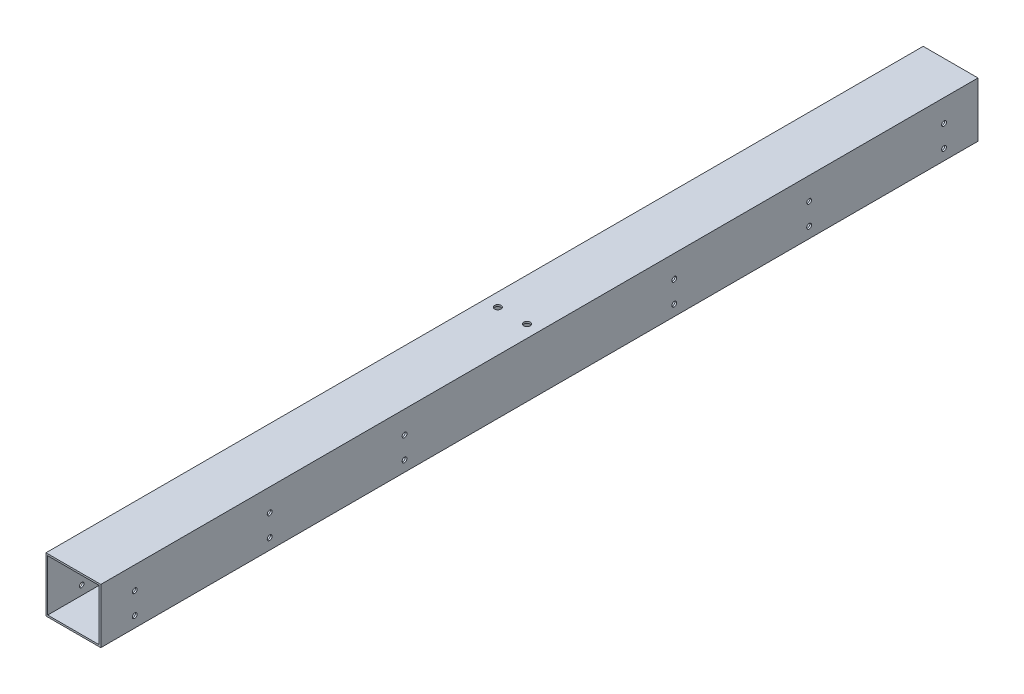
ISO-10303-21;
HEADER;
FILE_DESCRIPTION(('STEP AP214'),'2;1');
FILE_NAME('part.step','',(''),(''),'','','');
FILE_SCHEMA(('AUTOMOTIVE_DESIGN { 1 0 10303 214 1 1 1 1 }'));
ENDSEC;
DATA;
#1=APPLICATION_CONTEXT('core data for automotive mechanical design processes');
#2=APPLICATION_PROTOCOL_DEFINITION('international standard','automotive_design',2000,#1);
#3=PRODUCT_CONTEXT('',#1,'mechanical');
#4=PRODUCT('Part','Part','',(#3));
#5=PRODUCT_RELATED_PRODUCT_CATEGORY('part','',(#4));
#6=PRODUCT_DEFINITION_FORMATION('','',#4);
#7=PRODUCT_DEFINITION_CONTEXT('part definition',#1,'design');
#8=PRODUCT_DEFINITION('design','',#6,#7);
#9=PRODUCT_DEFINITION_SHAPE('','',#8);
#10=(LENGTH_UNIT() NAMED_UNIT(*) SI_UNIT(.MILLI.,.METRE.));
#11=(NAMED_UNIT(*) PLANE_ANGLE_UNIT() SI_UNIT($,.RADIAN.));
#12=(NAMED_UNIT(*) SI_UNIT($,.STERADIAN.) SOLID_ANGLE_UNIT());
#13=UNCERTAINTY_MEASURE_WITH_UNIT(LENGTH_MEASURE(1.E-05),#10,'distance_accuracy_value','');
#14=(GEOMETRIC_REPRESENTATION_CONTEXT(3) GLOBAL_UNCERTAINTY_ASSIGNED_CONTEXT((#13)) GLOBAL_UNIT_ASSIGNED_CONTEXT((#10,
#11,#12)) REPRESENTATION_CONTEXT('',''));
#15=CARTESIAN_POINT('',(0.,0.,0.));
#16=DIRECTION('',(0.,0.,1.));
#17=DIRECTION('',(1.,0.,0.));
#18=AXIS2_PLACEMENT_3D('',#15,#16,#17);
#19=CARTESIAN_POINT('',(-50.8,50.8,813.));
#20=DIRECTION('',(0.,-1.,0.));
#21=DIRECTION('',(0.,0.,-1.));
#22=AXIS2_PLACEMENT_3D('',#19,#20,#21);
#23=PLANE('',#22);
#24=DIRECTION('',(-1.,0.,0.));
#25=VECTOR('',#24,1.);
#26=CARTESIAN_POINT('',(-50.8,50.8,-813.));
#27=LINE('',#26,#25);
#28=CARTESIAN_POINT('',(50.8,50.8,-813.));
#29=VERTEX_POINT('',#28);
#30=CARTESIAN_POINT('',(-50.8,50.8,-813.));
#31=VERTEX_POINT('',#30);
#32=EDGE_CURVE('E204',#29,#31,#27,.T.);
#33=ORIENTED_EDGE('',*,*,#32,.T.);
#34=DIRECTION('',(0.,0.,-1.));
#35=VECTOR('',#34,1.);
#36=CARTESIAN_POINT('',(-50.8,50.8,813.));
#37=LINE('',#36,#35);
#38=CARTESIAN_POINT('',(-50.8,50.8,813.));
#39=VERTEX_POINT('',#38);
#40=EDGE_CURVE('E219',#39,#31,#37,.T.);
#41=ORIENTED_EDGE('',*,*,#40,.F.);
#42=DIRECTION('',(-1.,0.,0.));
#43=VECTOR('',#42,1.);
#44=CARTESIAN_POINT('',(-50.8,50.8,813.));
#45=LINE('',#44,#43);
#46=CARTESIAN_POINT('',(50.8,50.8,813.));
#47=VERTEX_POINT('',#46);
#48=EDGE_CURVE('E190',#47,#39,#45,.T.);
#49=ORIENTED_EDGE('',*,*,#48,.F.);
#50=DIRECTION('',(0.,0.,-1.));
#51=VECTOR('',#50,1.);
#52=CARTESIAN_POINT('',(50.8,50.8,813.));
#53=LINE('',#52,#51);
#54=EDGE_CURVE('E223',#47,#29,#53,.T.);
#55=ORIENTED_EDGE('',*,*,#54,.T.);
#56=EDGE_LOOP('',(#33,#41,#49,#55));
#57=FACE_BOUND('',#56,.T.);
#58=CARTESIAN_POINT('',(27.8,50.8,0.));
#59=DIRECTION('',(0.,1.,0.));
#60=DIRECTION('',(0.,0.,1.));
#61=AXIS2_PLACEMENT_3D('',#58,#59,#60);
#62=CIRCLE('',#61,6.);
#63=CARTESIAN_POINT('',(27.8,50.8,5.99999999999999));
#64=VERTEX_POINT('',#63);
#65=EDGE_CURVE('E529',#64,#64,#62,.T.);
#66=ORIENTED_EDGE('',*,*,#65,.F.);
#67=EDGE_LOOP('',(#66));
#68=FACE_BOUND('',#67,.T.);
#69=CARTESIAN_POINT('',(-26.2,50.8,0.));
#70=DIRECTION('',(0.,1.,0.));
#71=DIRECTION('',(0.,0.,1.));
#72=AXIS2_PLACEMENT_3D('',#69,#70,#71);
#73=CIRCLE('',#72,6.);
#74=CARTESIAN_POINT('',(-26.2,50.8,6.00000000000001));
#75=VERTEX_POINT('',#74);
#76=EDGE_CURVE('E524',#75,#75,#73,.T.);
#77=ORIENTED_EDGE('',*,*,#76,.F.);
#78=EDGE_LOOP('',(#77));
#79=FACE_BOUND('',#78,.T.);
#80=ADVANCED_FACE('F67',(#57,#68,#79),#23,.F.);
#81=CARTESIAN_POINT('',(-50.8,-30.8,-750.));
#82=DIRECTION('',(-1.,0.,0.));
#83=DIRECTION('',(0.,0.,1.));
#84=AXIS2_PLACEMENT_3D('',#81,#82,#83);
#85=CYLINDRICAL_SURFACE('',#84,4.2);
#86=CARTESIAN_POINT('',(-50.8,-30.8,-750.));
#87=DIRECTION('',(-1.,0.,0.));
#88=DIRECTION('',(0.,0.,1.));
#89=AXIS2_PLACEMENT_3D('',#86,#87,#88);
#90=CIRCLE('',#89,4.2);
#91=CARTESIAN_POINT('',(-50.8,-30.8,-745.8));
#92=VERTEX_POINT('',#91);
#93=EDGE_CURVE('E76',#92,#92,#90,.T.);
#94=ORIENTED_EDGE('',*,*,#93,.T.);
#95=EDGE_LOOP('',(#94));
#96=FACE_BOUND('',#95,.T.);
#97=CARTESIAN_POINT('',(-47.625,-30.8,-750.));
#98=DIRECTION('',(1.,0.,0.));
#99=DIRECTION('',(0.,1.,0.));
#100=AXIS2_PLACEMENT_3D('',#97,#98,#99);
#101=CIRCLE('',#100,4.2);
#102=CARTESIAN_POINT('',(-47.625,-26.6,-750.));
#103=VERTEX_POINT('',#102);
#104=EDGE_CURVE('E12',#103,#103,#101,.T.);
#105=ORIENTED_EDGE('',*,*,#104,.T.);
#106=EDGE_LOOP('',(#105));
#107=FACE_BOUND('',#106,.T.);
#108=ADVANCED_FACE('F69',(#96,#107),#85,.F.);
#109=CARTESIAN_POINT('',(-50.8,-30.8,-500.));
#110=DIRECTION('',(-1.,0.,0.));
#111=DIRECTION('',(0.,0.,1.));
#112=AXIS2_PLACEMENT_3D('',#109,#110,#111);
#113=CYLINDRICAL_SURFACE('',#112,4.2);
#114=CARTESIAN_POINT('',(-50.8,-30.8,-500.));
#115=DIRECTION('',(-1.,0.,0.));
#116=DIRECTION('',(0.,0.,1.));
#117=AXIS2_PLACEMENT_3D('',#114,#115,#116);
#118=CIRCLE('',#117,4.2);
#119=CARTESIAN_POINT('',(-50.8,-30.8,-495.8));
#120=VERTEX_POINT('',#119);
#121=EDGE_CURVE('E275',#120,#120,#118,.T.);
#122=ORIENTED_EDGE('',*,*,#121,.T.);
#123=EDGE_LOOP('',(#122));
#124=FACE_BOUND('',#123,.T.);
#125=CARTESIAN_POINT('',(-47.625,-30.8,-500.));
#126=DIRECTION('',(1.,0.,0.));
#127=DIRECTION('',(0.,1.,0.));
#128=AXIS2_PLACEMENT_3D('',#125,#126,#127);
#129=CIRCLE('',#128,4.2);
#130=CARTESIAN_POINT('',(-47.625,-26.6,-500.));
#131=VERTEX_POINT('',#130);
#132=EDGE_CURVE('E279',#131,#131,#129,.T.);
#133=ORIENTED_EDGE('',*,*,#132,.T.);
#134=EDGE_LOOP('',(#133));
#135=FACE_BOUND('',#134,.T.);
#136=ADVANCED_FACE('F312',(#124,#135),#113,.F.);
#137=CARTESIAN_POINT('',(-50.8,-30.8,-250.));
#138=DIRECTION('',(-1.,0.,0.));
#139=DIRECTION('',(0.,0.,1.));
#140=AXIS2_PLACEMENT_3D('',#137,#138,#139);
#141=CYLINDRICAL_SURFACE('',#140,4.2);
#142=CARTESIAN_POINT('',(-50.8,-30.8,-250.));
#143=DIRECTION('',(-1.,0.,0.));
#144=DIRECTION('',(0.,0.,1.));
#145=AXIS2_PLACEMENT_3D('',#142,#143,#144);
#146=CIRCLE('',#145,4.2);
#147=CARTESIAN_POINT('',(-50.8,-30.8,-245.8));
#148=VERTEX_POINT('',#147);
#149=EDGE_CURVE('E267',#148,#148,#146,.T.);
#150=ORIENTED_EDGE('',*,*,#149,.T.);
#151=EDGE_LOOP('',(#150));
#152=FACE_BOUND('',#151,.T.);
#153=CARTESIAN_POINT('',(-47.625,-30.8,-250.));
#154=DIRECTION('',(1.,0.,0.));
#155=DIRECTION('',(0.,1.,0.));
#156=AXIS2_PLACEMENT_3D('',#153,#154,#155);
#157=CIRCLE('',#156,4.2);
#158=CARTESIAN_POINT('',(-47.625,-26.6,-250.));
#159=VERTEX_POINT('',#158);
#160=EDGE_CURVE('E271',#159,#159,#157,.T.);
#161=ORIENTED_EDGE('',*,*,#160,.T.);
#162=EDGE_LOOP('',(#161));
#163=FACE_BOUND('',#162,.T.);
#164=ADVANCED_FACE('F334',(#152,#163),#141,.F.);
#165=CARTESIAN_POINT('',(-50.8,-30.8,250.));
#166=DIRECTION('',(-1.,0.,0.));
#167=DIRECTION('',(0.,0.,1.));
#168=AXIS2_PLACEMENT_3D('',#165,#166,#167);
#169=CYLINDRICAL_SURFACE('',#168,4.2);
#170=CARTESIAN_POINT('',(-50.8,-30.8,250.));
#171=DIRECTION('',(-1.,0.,0.));
#172=DIRECTION('',(0.,0.,1.));
#173=AXIS2_PLACEMENT_3D('',#170,#171,#172);
#174=CIRCLE('',#173,4.2);
#175=CARTESIAN_POINT('',(-50.8,-30.8,254.2));
#176=VERTEX_POINT('',#175);
#177=EDGE_CURVE('E259',#176,#176,#174,.T.);
#178=ORIENTED_EDGE('',*,*,#177,.T.);
#179=EDGE_LOOP('',(#178));
#180=FACE_BOUND('',#179,.T.);
#181=CARTESIAN_POINT('',(-47.625,-30.8,250.));
#182=DIRECTION('',(1.,0.,0.));
#183=DIRECTION('',(0.,1.,0.));
#184=AXIS2_PLACEMENT_3D('',#181,#182,#183);
#185=CIRCLE('',#184,4.2);
#186=CARTESIAN_POINT('',(-47.625,-26.6,250.));
#187=VERTEX_POINT('',#186);
#188=EDGE_CURVE('E263',#187,#187,#185,.T.);
#189=ORIENTED_EDGE('',*,*,#188,.T.);
#190=EDGE_LOOP('',(#189));
#191=FACE_BOUND('',#190,.T.);
#192=ADVANCED_FACE('F330',(#180,#191),#169,.F.);
#193=CARTESIAN_POINT('',(-50.8,9.2,-750.));
#194=DIRECTION('',(-1.,0.,0.));
#195=DIRECTION('',(0.,0.,1.));
#196=AXIS2_PLACEMENT_3D('',#193,#194,#195);
#197=CYLINDRICAL_SURFACE('',#196,4.2);
#198=CARTESIAN_POINT('',(-50.8,9.2,-750.));
#199=DIRECTION('',(-1.,0.,0.));
#200=DIRECTION('',(0.,0.,1.));
#201=AXIS2_PLACEMENT_3D('',#198,#199,#200);
#202=CIRCLE('',#201,4.2);
#203=CARTESIAN_POINT('',(-50.8,9.2,-745.8));
#204=VERTEX_POINT('',#203);
#205=EDGE_CURVE('E251',#204,#204,#202,.T.);
#206=ORIENTED_EDGE('',*,*,#205,.T.);
#207=EDGE_LOOP('',(#206));
#208=FACE_BOUND('',#207,.T.);
#209=CARTESIAN_POINT('',(-47.625,9.2,-750.));
#210=DIRECTION('',(1.,0.,0.));
#211=DIRECTION('',(0.,1.,0.));
#212=AXIS2_PLACEMENT_3D('',#209,#210,#211);
#213=CIRCLE('',#212,4.2);
#214=CARTESIAN_POINT('',(-47.625,13.4,-750.));
#215=VERTEX_POINT('',#214);
#216=EDGE_CURVE('E255',#215,#215,#213,.T.);
#217=ORIENTED_EDGE('',*,*,#216,.T.);
#218=EDGE_LOOP('',(#217));
#219=FACE_BOUND('',#218,.T.);
#220=ADVANCED_FACE('F326',(#208,#219),#197,.F.);
#221=CARTESIAN_POINT('',(-50.8,9.2,-500.));
#222=DIRECTION('',(-1.,0.,0.));
#223=DIRECTION('',(0.,0.,1.));
#224=AXIS2_PLACEMENT_3D('',#221,#222,#223);
#225=CYLINDRICAL_SURFACE('',#224,4.2);
#226=CARTESIAN_POINT('',(-50.8,9.2,-500.));
#227=DIRECTION('',(-1.,0.,0.));
#228=DIRECTION('',(0.,0.,1.));
#229=AXIS2_PLACEMENT_3D('',#226,#227,#228);
#230=CIRCLE('',#229,4.2);
#231=CARTESIAN_POINT('',(-50.8,9.2,-495.8));
#232=VERTEX_POINT('',#231);
#233=EDGE_CURVE('E243',#232,#232,#230,.T.);
#234=ORIENTED_EDGE('',*,*,#233,.T.);
#235=EDGE_LOOP('',(#234));
#236=FACE_BOUND('',#235,.T.);
#237=CARTESIAN_POINT('',(-47.625,9.2,-500.));
#238=DIRECTION('',(1.,0.,0.));
#239=DIRECTION('',(0.,1.,0.));
#240=AXIS2_PLACEMENT_3D('',#237,#238,#239);
#241=CIRCLE('',#240,4.2);
#242=CARTESIAN_POINT('',(-47.625,13.4,-500.));
#243=VERTEX_POINT('',#242);
#244=EDGE_CURVE('E247',#243,#243,#241,.T.);
#245=ORIENTED_EDGE('',*,*,#244,.T.);
#246=EDGE_LOOP('',(#245));
#247=FACE_BOUND('',#246,.T.);
#248=ADVANCED_FACE('F322',(#236,#247),#225,.F.);
#249=CARTESIAN_POINT('',(-50.8,9.2,-250.));
#250=DIRECTION('',(-1.,0.,0.));
#251=DIRECTION('',(0.,0.,1.));
#252=AXIS2_PLACEMENT_3D('',#249,#250,#251);
#253=CYLINDRICAL_SURFACE('',#252,4.2);
#254=CARTESIAN_POINT('',(-50.8,9.2,-250.));
#255=DIRECTION('',(-1.,0.,0.));
#256=DIRECTION('',(0.,0.,1.));
#257=AXIS2_PLACEMENT_3D('',#254,#255,#256);
#258=CIRCLE('',#257,4.2);
#259=CARTESIAN_POINT('',(-50.8,9.2,-245.8));
#260=VERTEX_POINT('',#259);
#261=EDGE_CURVE('E235',#260,#260,#258,.T.);
#262=ORIENTED_EDGE('',*,*,#261,.T.);
#263=EDGE_LOOP('',(#262));
#264=FACE_BOUND('',#263,.T.);
#265=CARTESIAN_POINT('',(-47.625,9.2,-250.));
#266=DIRECTION('',(1.,0.,0.));
#267=DIRECTION('',(0.,1.,0.));
#268=AXIS2_PLACEMENT_3D('',#265,#266,#267);
#269=CIRCLE('',#268,4.2);
#270=CARTESIAN_POINT('',(-47.625,13.4,-250.));
#271=VERTEX_POINT('',#270);
#272=EDGE_CURVE('E239',#271,#271,#269,.T.);
#273=ORIENTED_EDGE('',*,*,#272,.T.);
#274=EDGE_LOOP('',(#273));
#275=FACE_BOUND('',#274,.T.);
#276=ADVANCED_FACE('F300',(#264,#275),#253,.F.);
#277=CARTESIAN_POINT('',(-50.8,9.2,250.));
#278=DIRECTION('',(-1.,0.,0.));
#279=DIRECTION('',(0.,0.,1.));
#280=AXIS2_PLACEMENT_3D('',#277,#278,#279);
#281=CYLINDRICAL_SURFACE('',#280,4.2);
#282=CARTESIAN_POINT('',(-50.8,9.2,250.));
#283=DIRECTION('',(-1.,0.,0.));
#284=DIRECTION('',(0.,0.,1.));
#285=AXIS2_PLACEMENT_3D('',#282,#283,#284);
#286=CIRCLE('',#285,4.2);
#287=CARTESIAN_POINT('',(-50.8,9.2,254.2));
#288=VERTEX_POINT('',#287);
#289=EDGE_CURVE('E227',#288,#288,#286,.T.);
#290=ORIENTED_EDGE('',*,*,#289,.T.);
#291=EDGE_LOOP('',(#290));
#292=FACE_BOUND('',#291,.T.);
#293=CARTESIAN_POINT('',(-47.625,9.2,250.));
#294=DIRECTION('',(1.,0.,0.));
#295=DIRECTION('',(0.,1.,0.));
#296=AXIS2_PLACEMENT_3D('',#293,#294,#295);
#297=CIRCLE('',#296,4.2);
#298=CARTESIAN_POINT('',(-47.625,13.4,250.));
#299=VERTEX_POINT('',#298);
#300=EDGE_CURVE('E231',#299,#299,#297,.T.);
#301=ORIENTED_EDGE('',*,*,#300,.T.);
#302=EDGE_LOOP('',(#301));
#303=FACE_BOUND('',#302,.T.);
#304=ADVANCED_FACE('F290',(#292,#303),#281,.F.);
#305=CARTESIAN_POINT('',(-50.8,50.8,813.));
#306=DIRECTION('',(1.,0.,0.));
#307=DIRECTION('',(0.,1.,0.));
#308=AXIS2_PLACEMENT_3D('',#305,#306,#307);
#309=PLANE('',#308);
#310=CARTESIAN_POINT('',(-50.8,-30.8,500.));
#311=DIRECTION('',(-1.,0.,0.));
#312=DIRECTION('',(0.,0.,1.));
#313=AXIS2_PLACEMENT_3D('',#310,#311,#312);
#314=CIRCLE('',#313,4.2);
#315=CARTESIAN_POINT('',(-50.8,-30.8,504.2));
#316=VERTEX_POINT('',#315);
#317=EDGE_CURVE('E621',#316,#316,#314,.T.);
#318=ORIENTED_EDGE('',*,*,#317,.F.);
#319=EDGE_LOOP('',(#318));
#320=FACE_BOUND('',#319,.T.);
#321=CARTESIAN_POINT('',(-50.8,9.2,500.));
#322=DIRECTION('',(-1.,0.,0.));
#323=DIRECTION('',(0.,0.,1.));
#324=AXIS2_PLACEMENT_3D('',#321,#322,#323);
#325=CIRCLE('',#324,4.2);
#326=CARTESIAN_POINT('',(-50.8,9.2,504.2));
#327=VERTEX_POINT('',#326);
#328=EDGE_CURVE('E629',#327,#327,#325,.T.);
#329=ORIENTED_EDGE('',*,*,#328,.F.);
#330=EDGE_LOOP('',(#329));
#331=FACE_BOUND('',#330,.T.);
#332=DIRECTION('',(0.,-1.,0.));
#333=VECTOR('',#332,1.);
#334=CARTESIAN_POINT('',(-50.8,50.8,-813.));
#335=LINE('',#334,#333);
#336=CARTESIAN_POINT('',(-50.8,-50.8,-813.));
#337=VERTEX_POINT('',#336);
#338=EDGE_CURVE('E207',#31,#337,#335,.T.);
#339=ORIENTED_EDGE('',*,*,#338,.T.);
#340=DIRECTION('',(0.,0.,-1.));
#341=VECTOR('',#340,1.);
#342=CARTESIAN_POINT('',(-50.8,-50.8,813.));
#343=LINE('',#342,#341);
#344=CARTESIAN_POINT('',(-50.8,-50.8,813.));
#345=VERTEX_POINT('',#344);
#346=EDGE_CURVE('E215',#345,#337,#343,.T.);
#347=ORIENTED_EDGE('',*,*,#346,.F.);
#348=DIRECTION('',(0.,-1.,0.));
#349=VECTOR('',#348,1.);
#350=CARTESIAN_POINT('',(-50.8,50.8,813.));
#351=LINE('',#350,#349);
#352=EDGE_CURVE('E194',#39,#345,#351,.T.);
#353=ORIENTED_EDGE('',*,*,#352,.F.);
#354=ORIENTED_EDGE('',*,*,#40,.T.);
#355=EDGE_LOOP('',(#339,#347,#353,#354));
#356=FACE_BOUND('',#355,.T.);
#357=CARTESIAN_POINT('',(-50.8,-30.8,750.));
#358=DIRECTION('',(-1.,0.,0.));
#359=DIRECTION('',(0.,0.,1.));
#360=AXIS2_PLACEMENT_3D('',#357,#358,#359);
#361=CIRCLE('',#360,4.2);
#362=CARTESIAN_POINT('',(-50.8,-30.8,754.2));
#363=VERTEX_POINT('',#362);
#364=EDGE_CURVE('E391',#363,#363,#361,.T.);
#365=ORIENTED_EDGE('',*,*,#364,.F.);
#366=EDGE_LOOP('',(#365));
#367=FACE_BOUND('',#366,.T.);
#368=CARTESIAN_POINT('',(-50.8,9.2,750.));
#369=DIRECTION('',(-1.,0.,0.));
#370=DIRECTION('',(0.,0.,1.));
#371=AXIS2_PLACEMENT_3D('',#368,#369,#370);
#372=CIRCLE('',#371,4.2);
#373=CARTESIAN_POINT('',(-50.8,9.2,754.2));
#374=VERTEX_POINT('',#373);
#375=EDGE_CURVE('E395',#374,#374,#372,.T.);
#376=ORIENTED_EDGE('',*,*,#375,.F.);
#377=EDGE_LOOP('',(#376));
#378=FACE_BOUND('',#377,.T.);
#379=ORIENTED_EDGE('',*,*,#289,.F.);
#380=EDGE_LOOP('',(#379));
#381=FACE_BOUND('',#380,.T.);
#382=ORIENTED_EDGE('',*,*,#261,.F.);
#383=EDGE_LOOP('',(#382));
#384=FACE_BOUND('',#383,.T.);
#385=ORIENTED_EDGE('',*,*,#233,.F.);
#386=EDGE_LOOP('',(#385));
#387=FACE_BOUND('',#386,.T.);
#388=ORIENTED_EDGE('',*,*,#205,.F.);
#389=EDGE_LOOP('',(#388));
#390=FACE_BOUND('',#389,.T.);
#391=ORIENTED_EDGE('',*,*,#177,.F.);
#392=EDGE_LOOP('',(#391));
#393=FACE_BOUND('',#392,.T.);
#394=ORIENTED_EDGE('',*,*,#149,.F.);
#395=EDGE_LOOP('',(#394));
#396=FACE_BOUND('',#395,.T.);
#397=ORIENTED_EDGE('',*,*,#121,.F.);
#398=EDGE_LOOP('',(#397));
#399=FACE_BOUND('',#398,.T.);
#400=ORIENTED_EDGE('',*,*,#93,.F.);
#401=EDGE_LOOP('',(#400));
#402=FACE_BOUND('',#401,.T.);
#403=ADVANCED_FACE('F288',(#320,#331,#356,#367,#378,#381,#384,#387,#390,#393,#396,#399,#402),
#309,.F.);
#404=CARTESIAN_POINT('',(0.,0.,813.));
#405=DIRECTION('',(0.,0.,1.));
#406=DIRECTION('',(1.,0.,0.));
#407=AXIS2_PLACEMENT_3D('',#404,#405,#406);
#408=PLANE('',#407);
#409=DIRECTION('',(0.,1.,0.));
#410=VECTOR('',#409,1.);
#411=CARTESIAN_POINT('',(50.8,50.8,813.));
#412=LINE('',#411,#410);
#413=CARTESIAN_POINT('',(50.8,-50.8,813.));
#414=VERTEX_POINT('',#413);
#415=EDGE_CURVE('E186',#414,#47,#412,.T.);
#416=ORIENTED_EDGE('',*,*,#415,.T.);
#417=ORIENTED_EDGE('',*,*,#48,.T.);
#418=ORIENTED_EDGE('',*,*,#352,.T.);
#419=DIRECTION('',(1.,0.,0.));
#420=VECTOR('',#419,1.);
#421=CARTESIAN_POINT('',(-50.8,-50.8,813.));
#422=LINE('',#421,#420);
#423=EDGE_CURVE('E197',#345,#414,#422,.T.);
#424=ORIENTED_EDGE('',*,*,#423,.T.);
#425=EDGE_LOOP('',(#416,#417,#418,#424));
#426=FACE_BOUND('',#425,.T.);
#427=DIRECTION('',(-1.,0.,0.));
#428=VECTOR('',#427,1.);
#429=CARTESIAN_POINT('',(-50.8,47.625,813.));
#430=LINE('',#429,#428);
#431=CARTESIAN_POINT('',(47.625,47.625,813.));
#432=VERTEX_POINT('',#431);
#433=CARTESIAN_POINT('',(-47.625,47.625,813.));
#434=VERTEX_POINT('',#433);
#435=EDGE_CURVE('E144',#432,#434,#430,.T.);
#436=ORIENTED_EDGE('',*,*,#435,.F.);
#437=DIRECTION('',(0.,1.,0.));
#438=VECTOR('',#437,1.);
#439=CARTESIAN_POINT('',(47.625,50.8,813.));
#440=LINE('',#439,#438);
#441=CARTESIAN_POINT('',(47.625,-47.625,813.));
#442=VERTEX_POINT('',#441);
#443=EDGE_CURVE('E135',#442,#432,#440,.T.);
#444=ORIENTED_EDGE('',*,*,#443,.F.);
#445=DIRECTION('',(1.,0.,0.));
#446=VECTOR('',#445,1.);
#447=CARTESIAN_POINT('',(-50.8,-47.625,813.));
#448=LINE('',#447,#446);
#449=CARTESIAN_POINT('',(-47.625,-47.625,813.));
#450=VERTEX_POINT('',#449);
#451=EDGE_CURVE('E162',#450,#442,#448,.T.);
#452=ORIENTED_EDGE('',*,*,#451,.F.);
#453=DIRECTION('',(0.,-1.,0.));
#454=VECTOR('',#453,1.);
#455=CARTESIAN_POINT('',(-47.625,50.8,813.));
#456=LINE('',#455,#454);
#457=EDGE_CURVE('E158',#434,#450,#456,.T.);
#458=ORIENTED_EDGE('',*,*,#457,.F.);
#459=EDGE_LOOP('',(#436,#444,#452,#458));
#460=FACE_BOUND('',#459,.T.);
#461=ADVANCED_FACE('F157',(#426,#460),#408,.T.);
#462=CARTESIAN_POINT('',(0.,0.,-813.));
#463=DIRECTION('',(0.,0.,1.));
#464=DIRECTION('',(1.,0.,0.));
#465=AXIS2_PLACEMENT_3D('',#462,#463,#464);
#466=PLANE('',#465);
#467=DIRECTION('',(0.,1.,0.));
#468=VECTOR('',#467,1.);
#469=CARTESIAN_POINT('',(50.8,50.8,-813.));
#470=LINE('',#469,#468);
#471=CARTESIAN_POINT('',(50.8,-50.8,-813.));
#472=VERTEX_POINT('',#471);
#473=EDGE_CURVE('E153',#472,#29,#470,.T.);
#474=ORIENTED_EDGE('',*,*,#473,.F.);
#475=DIRECTION('',(1.,0.,0.));
#476=VECTOR('',#475,1.);
#477=CARTESIAN_POINT('',(-50.8,-50.8,-813.));
#478=LINE('',#477,#476);
#479=EDGE_CURVE('E191',#337,#472,#478,.T.);
#480=ORIENTED_EDGE('',*,*,#479,.F.);
#481=ORIENTED_EDGE('',*,*,#338,.F.);
#482=ORIENTED_EDGE('',*,*,#32,.F.);
#483=EDGE_LOOP('',(#474,#480,#481,#482));
#484=FACE_BOUND('',#483,.T.);
#485=DIRECTION('',(0.,1.,0.));
#486=VECTOR('',#485,1.);
#487=CARTESIAN_POINT('',(47.625,50.8,-813.));
#488=LINE('',#487,#486);
#489=CARTESIAN_POINT('',(47.625,-47.625,-813.));
#490=VERTEX_POINT('',#489);
#491=CARTESIAN_POINT('',(47.625,47.625,-813.));
#492=VERTEX_POINT('',#491);
#493=EDGE_CURVE('E91',#490,#492,#488,.T.);
#494=ORIENTED_EDGE('',*,*,#493,.T.);
#495=DIRECTION('',(-1.,0.,0.));
#496=VECTOR('',#495,1.);
#497=CARTESIAN_POINT('',(-50.8,47.625,-813.));
#498=LINE('',#497,#496);
#499=CARTESIAN_POINT('',(-47.625,47.625,-813.));
#500=VERTEX_POINT('',#499);
#501=EDGE_CURVE('E151',#492,#500,#498,.T.);
#502=ORIENTED_EDGE('',*,*,#501,.T.);
#503=DIRECTION('',(0.,-1.,0.));
#504=VECTOR('',#503,1.);
#505=CARTESIAN_POINT('',(-47.625,50.8,-813.));
#506=LINE('',#505,#504);
#507=CARTESIAN_POINT('',(-47.625,-47.625,-813.));
#508=VERTEX_POINT('',#507);
#509=EDGE_CURVE('E173',#500,#508,#506,.T.);
#510=ORIENTED_EDGE('',*,*,#509,.T.);
#511=DIRECTION('',(1.,0.,0.));
#512=VECTOR('',#511,1.);
#513=CARTESIAN_POINT('',(-50.8,-47.625,-813.));
#514=LINE('',#513,#512);
#515=EDGE_CURVE('E145',#508,#490,#514,.T.);
#516=ORIENTED_EDGE('',*,*,#515,.T.);
#517=EDGE_LOOP('',(#494,#502,#510,#516));
#518=FACE_BOUND('',#517,.T.);
#519=ADVANCED_FACE('F297',(#484,#518),#466,.F.);
#520=CARTESIAN_POINT('',(50.8,50.8,813.));
#521=DIRECTION('',(-1.,0.,0.));
#522=DIRECTION('',(0.,-1.,0.));
#523=AXIS2_PLACEMENT_3D('',#520,#521,#522);
#524=PLANE('',#523);
#525=CARTESIAN_POINT('',(50.8,9.20000000000002,-750.));
#526=DIRECTION('',(-1.,0.,0.));
#527=DIRECTION('',(0.,-1.,0.));
#528=AXIS2_PLACEMENT_3D('',#525,#526,#527);
#529=CIRCLE('',#528,4.49999999999999);
#530=CARTESIAN_POINT('',(50.8,4.70000000000002,-750.));
#531=VERTEX_POINT('',#530);
#532=EDGE_CURVE('E545',#531,#531,#529,.T.);
#533=ORIENTED_EDGE('',*,*,#532,.T.);
#534=EDGE_LOOP('',(#533));
#535=FACE_BOUND('',#534,.T.);
#536=CARTESIAN_POINT('',(50.8,-30.8,-750.));
#537=DIRECTION('',(-1.,0.,0.));
#538=DIRECTION('',(0.,-1.,0.));
#539=AXIS2_PLACEMENT_3D('',#536,#537,#538);
#540=CIRCLE('',#539,4.49999999999999);
#541=CARTESIAN_POINT('',(50.8,-35.3,-750.));
#542=VERTEX_POINT('',#541);
#543=EDGE_CURVE('E553',#542,#542,#540,.T.);
#544=ORIENTED_EDGE('',*,*,#543,.T.);
#545=EDGE_LOOP('',(#544));
#546=FACE_BOUND('',#545,.T.);
#547=CARTESIAN_POINT('',(50.8,9.20000000000002,-500.));
#548=DIRECTION('',(-1.,0.,0.));
#549=DIRECTION('',(0.,-1.,0.));
#550=AXIS2_PLACEMENT_3D('',#547,#548,#549);
#551=CIRCLE('',#550,4.49999999999999);
#552=CARTESIAN_POINT('',(50.8,4.70000000000002,-500.));
#553=VERTEX_POINT('',#552);
#554=EDGE_CURVE('E561',#553,#553,#551,.T.);
#555=ORIENTED_EDGE('',*,*,#554,.T.);
#556=EDGE_LOOP('',(#555));
#557=FACE_BOUND('',#556,.T.);
#558=CARTESIAN_POINT('',(50.8,-30.8,-500.));
#559=DIRECTION('',(-1.,0.,0.));
#560=DIRECTION('',(0.,-1.,0.));
#561=AXIS2_PLACEMENT_3D('',#558,#559,#560);
#562=CIRCLE('',#561,4.49999999999999);
#563=CARTESIAN_POINT('',(50.8,-35.3,-500.));
#564=VERTEX_POINT('',#563);
#565=EDGE_CURVE('E569',#564,#564,#562,.T.);
#566=ORIENTED_EDGE('',*,*,#565,.T.);
#567=EDGE_LOOP('',(#566));
#568=FACE_BOUND('',#567,.T.);
#569=CARTESIAN_POINT('',(50.8,9.20000000000002,-250.));
#570=DIRECTION('',(-1.,0.,0.));
#571=DIRECTION('',(0.,-1.,0.));
#572=AXIS2_PLACEMENT_3D('',#569,#570,#571);
#573=CIRCLE('',#572,4.49999999999999);
#574=CARTESIAN_POINT('',(50.8,4.70000000000002,-250.));
#575=VERTEX_POINT('',#574);
#576=EDGE_CURVE('E577',#575,#575,#573,.T.);
#577=ORIENTED_EDGE('',*,*,#576,.T.);
#578=EDGE_LOOP('',(#577));
#579=FACE_BOUND('',#578,.T.);
#580=CARTESIAN_POINT('',(50.8,-30.8,-250.));
#581=DIRECTION('',(-1.,0.,0.));
#582=DIRECTION('',(0.,-1.,0.));
#583=AXIS2_PLACEMENT_3D('',#580,#581,#582);
#584=CIRCLE('',#583,4.49999999999999);
#585=CARTESIAN_POINT('',(50.8,-35.3,-250.));
#586=VERTEX_POINT('',#585);
#587=EDGE_CURVE('E585',#586,#586,#584,.T.);
#588=ORIENTED_EDGE('',*,*,#587,.T.);
#589=EDGE_LOOP('',(#588));
#590=FACE_BOUND('',#589,.T.);
#591=CARTESIAN_POINT('',(50.8,9.20000000000002,250.));
#592=DIRECTION('',(-1.,0.,0.));
#593=DIRECTION('',(0.,-1.,0.));
#594=AXIS2_PLACEMENT_3D('',#591,#592,#593);
#595=CIRCLE('',#594,4.49999999999999);
#596=CARTESIAN_POINT('',(50.8,4.70000000000002,250.));
#597=VERTEX_POINT('',#596);
#598=EDGE_CURVE('E593',#597,#597,#595,.T.);
#599=ORIENTED_EDGE('',*,*,#598,.T.);
#600=EDGE_LOOP('',(#599));
#601=FACE_BOUND('',#600,.T.);
#602=CARTESIAN_POINT('',(50.8,-30.8,250.));
#603=DIRECTION('',(-1.,0.,0.));
#604=DIRECTION('',(0.,-1.,0.));
#605=AXIS2_PLACEMENT_3D('',#602,#603,#604);
#606=CIRCLE('',#605,4.49999999999999);
#607=CARTESIAN_POINT('',(50.8,-35.3,250.));
#608=VERTEX_POINT('',#607);
#609=EDGE_CURVE('E601',#608,#608,#606,.T.);
#610=ORIENTED_EDGE('',*,*,#609,.T.);
#611=EDGE_LOOP('',(#610));
#612=FACE_BOUND('',#611,.T.);
#613=CARTESIAN_POINT('',(50.8,9.20000000000002,500.));
#614=DIRECTION('',(-1.,0.,0.));
#615=DIRECTION('',(0.,-1.,0.));
#616=AXIS2_PLACEMENT_3D('',#613,#614,#615);
#617=CIRCLE('',#616,4.49999999999999);
#618=CARTESIAN_POINT('',(50.8,4.70000000000002,500.));
#619=VERTEX_POINT('',#618);
#620=EDGE_CURVE('E609',#619,#619,#617,.T.);
#621=ORIENTED_EDGE('',*,*,#620,.T.);
#622=EDGE_LOOP('',(#621));
#623=FACE_BOUND('',#622,.T.);
#624=CARTESIAN_POINT('',(50.8,-30.8,500.));
#625=DIRECTION('',(-1.,0.,0.));
#626=DIRECTION('',(0.,-1.,0.));
#627=AXIS2_PLACEMENT_3D('',#624,#625,#626);
#628=CIRCLE('',#627,4.49999999999999);
#629=CARTESIAN_POINT('',(50.8,-35.3,500.));
#630=VERTEX_POINT('',#629);
#631=EDGE_CURVE('E617',#630,#630,#628,.T.);
#632=ORIENTED_EDGE('',*,*,#631,.T.);
#633=EDGE_LOOP('',(#632));
#634=FACE_BOUND('',#633,.T.);
#635=CARTESIAN_POINT('',(50.8,9.20000000000002,750.));
#636=DIRECTION('',(-1.,0.,0.));
#637=DIRECTION('',(0.,-1.,0.));
#638=AXIS2_PLACEMENT_3D('',#635,#636,#637);
#639=CIRCLE('',#638,4.49999999999999);
#640=CARTESIAN_POINT('',(50.8,4.70000000000002,750.));
#641=VERTEX_POINT('',#640);
#642=EDGE_CURVE('E641',#641,#641,#639,.T.);
#643=ORIENTED_EDGE('',*,*,#642,.T.);
#644=EDGE_LOOP('',(#643));
#645=FACE_BOUND('',#644,.T.);
#646=CARTESIAN_POINT('',(50.8,-30.8,750.));
#647=DIRECTION('',(-1.,0.,0.));
#648=DIRECTION('',(0.,-1.,0.));
#649=AXIS2_PLACEMENT_3D('',#646,#647,#648);
#650=CIRCLE('',#649,4.49999999999999);
#651=CARTESIAN_POINT('',(50.8,-35.3,750.));
#652=VERTEX_POINT('',#651);
#653=EDGE_CURVE('E429',#652,#652,#650,.T.);
#654=ORIENTED_EDGE('',*,*,#653,.T.);
#655=EDGE_LOOP('',(#654));
#656=FACE_BOUND('',#655,.T.);
#657=ORIENTED_EDGE('',*,*,#473,.T.);
#658=ORIENTED_EDGE('',*,*,#54,.F.);
#659=ORIENTED_EDGE('',*,*,#415,.F.);
#660=DIRECTION('',(0.,0.,-1.));
#661=VECTOR('',#660,1.);
#662=CARTESIAN_POINT('',(50.8,-50.8,813.));
#663=LINE('',#662,#661);
#664=EDGE_CURVE('E200',#414,#472,#663,.T.);
#665=ORIENTED_EDGE('',*,*,#664,.T.);
#666=EDGE_LOOP('',(#657,#658,#659,#665));
#667=FACE_BOUND('',#666,.T.);
#668=ADVANCED_FACE('F315',(#535,#546,#557,#568,#579,#590,#601,#612,#623,#634,#645,#656,#667),
#524,.F.);
#669=CARTESIAN_POINT('',(-50.8,-50.8,813.));
#670=DIRECTION('',(0.,1.,0.));
#671=DIRECTION('',(0.,0.,1.));
#672=AXIS2_PLACEMENT_3D('',#669,#670,#671);
#673=PLANE('',#672);
#674=ORIENTED_EDGE('',*,*,#479,.T.);
#675=ORIENTED_EDGE('',*,*,#664,.F.);
#676=ORIENTED_EDGE('',*,*,#423,.F.);
#677=ORIENTED_EDGE('',*,*,#346,.T.);
#678=EDGE_LOOP('',(#674,#675,#676,#677));
#679=FACE_BOUND('',#678,.T.);
#680=ADVANCED_FACE('F317',(#679),#673,.F.);
#681=CARTESIAN_POINT('',(47.625,50.8,813.));
#682=DIRECTION('',(-1.,0.,0.));
#683=DIRECTION('',(0.,-1.,0.));
#684=AXIS2_PLACEMENT_3D('',#681,#682,#683);
#685=PLANE('',#684);
#686=CARTESIAN_POINT('',(47.625,9.20000000000002,-750.));
#687=DIRECTION('',(-1.,0.,0.));
#688=DIRECTION('',(0.,0.,1.));
#689=AXIS2_PLACEMENT_3D('',#686,#687,#688);
#690=CIRCLE('',#689,4.49999999999999);
#691=CARTESIAN_POINT('',(47.625,9.20000000000002,-745.5));
#692=VERTEX_POINT('',#691);
#693=EDGE_CURVE('E541',#692,#692,#690,.T.);
#694=ORIENTED_EDGE('',*,*,#693,.F.);
#695=EDGE_LOOP('',(#694));
#696=FACE_BOUND('',#695,.T.);
#697=CARTESIAN_POINT('',(47.625,-30.8,-750.));
#698=DIRECTION('',(-1.,0.,0.));
#699=DIRECTION('',(0.,0.,1.));
#700=AXIS2_PLACEMENT_3D('',#697,#698,#699);
#701=CIRCLE('',#700,4.49999999999999);
#702=CARTESIAN_POINT('',(47.625,-30.8,-745.5));
#703=VERTEX_POINT('',#702);
#704=EDGE_CURVE('E549',#703,#703,#701,.T.);
#705=ORIENTED_EDGE('',*,*,#704,.F.);
#706=EDGE_LOOP('',(#705));
#707=FACE_BOUND('',#706,.T.);
#708=CARTESIAN_POINT('',(47.625,9.20000000000002,-500.));
#709=DIRECTION('',(-1.,0.,0.));
#710=DIRECTION('',(0.,0.,1.));
#711=AXIS2_PLACEMENT_3D('',#708,#709,#710);
#712=CIRCLE('',#711,4.49999999999999);
#713=CARTESIAN_POINT('',(47.625,9.20000000000002,-495.5));
#714=VERTEX_POINT('',#713);
#715=EDGE_CURVE('E557',#714,#714,#712,.T.);
#716=ORIENTED_EDGE('',*,*,#715,.F.);
#717=EDGE_LOOP('',(#716));
#718=FACE_BOUND('',#717,.T.);
#719=CARTESIAN_POINT('',(47.625,-30.8,-500.));
#720=DIRECTION('',(-1.,0.,0.));
#721=DIRECTION('',(0.,0.,1.));
#722=AXIS2_PLACEMENT_3D('',#719,#720,#721);
#723=CIRCLE('',#722,4.49999999999999);
#724=CARTESIAN_POINT('',(47.625,-30.8,-495.5));
#725=VERTEX_POINT('',#724);
#726=EDGE_CURVE('E565',#725,#725,#723,.T.);
#727=ORIENTED_EDGE('',*,*,#726,.F.);
#728=EDGE_LOOP('',(#727));
#729=FACE_BOUND('',#728,.T.);
#730=CARTESIAN_POINT('',(47.625,9.20000000000002,-250.));
#731=DIRECTION('',(-1.,0.,0.));
#732=DIRECTION('',(0.,0.,1.));
#733=AXIS2_PLACEMENT_3D('',#730,#731,#732);
#734=CIRCLE('',#733,4.49999999999999);
#735=CARTESIAN_POINT('',(47.625,9.20000000000002,-245.5));
#736=VERTEX_POINT('',#735);
#737=EDGE_CURVE('E573',#736,#736,#734,.T.);
#738=ORIENTED_EDGE('',*,*,#737,.F.);
#739=EDGE_LOOP('',(#738));
#740=FACE_BOUND('',#739,.T.);
#741=CARTESIAN_POINT('',(47.625,-30.8,-250.));
#742=DIRECTION('',(-1.,0.,0.));
#743=DIRECTION('',(0.,0.,1.));
#744=AXIS2_PLACEMENT_3D('',#741,#742,#743);
#745=CIRCLE('',#744,4.49999999999999);
#746=CARTESIAN_POINT('',(47.625,-30.8,-245.5));
#747=VERTEX_POINT('',#746);
#748=EDGE_CURVE('E581',#747,#747,#745,.T.);
#749=ORIENTED_EDGE('',*,*,#748,.F.);
#750=EDGE_LOOP('',(#749));
#751=FACE_BOUND('',#750,.T.);
#752=CARTESIAN_POINT('',(47.625,9.20000000000002,250.));
#753=DIRECTION('',(-1.,0.,0.));
#754=DIRECTION('',(0.,0.,1.));
#755=AXIS2_PLACEMENT_3D('',#752,#753,#754);
#756=CIRCLE('',#755,4.49999999999999);
#757=CARTESIAN_POINT('',(47.625,9.20000000000002,254.5));
#758=VERTEX_POINT('',#757);
#759=EDGE_CURVE('E589',#758,#758,#756,.T.);
#760=ORIENTED_EDGE('',*,*,#759,.F.);
#761=EDGE_LOOP('',(#760));
#762=FACE_BOUND('',#761,.T.);
#763=CARTESIAN_POINT('',(47.625,-30.8,250.));
#764=DIRECTION('',(-1.,0.,0.));
#765=DIRECTION('',(0.,0.,1.));
#766=AXIS2_PLACEMENT_3D('',#763,#764,#765);
#767=CIRCLE('',#766,4.49999999999999);
#768=CARTESIAN_POINT('',(47.625,-30.8,254.5));
#769=VERTEX_POINT('',#768);
#770=EDGE_CURVE('E597',#769,#769,#767,.T.);
#771=ORIENTED_EDGE('',*,*,#770,.F.);
#772=EDGE_LOOP('',(#771));
#773=FACE_BOUND('',#772,.T.);
#774=CARTESIAN_POINT('',(47.625,9.20000000000002,500.));
#775=DIRECTION('',(-1.,0.,0.));
#776=DIRECTION('',(0.,0.,1.));
#777=AXIS2_PLACEMENT_3D('',#774,#775,#776);
#778=CIRCLE('',#777,4.49999999999999);
#779=CARTESIAN_POINT('',(47.625,9.20000000000002,504.5));
#780=VERTEX_POINT('',#779);
#781=EDGE_CURVE('E605',#780,#780,#778,.T.);
#782=ORIENTED_EDGE('',*,*,#781,.F.);
#783=EDGE_LOOP('',(#782));
#784=FACE_BOUND('',#783,.T.);
#785=CARTESIAN_POINT('',(47.625,-30.8,500.));
#786=DIRECTION('',(-1.,0.,0.));
#787=DIRECTION('',(0.,0.,1.));
#788=AXIS2_PLACEMENT_3D('',#785,#786,#787);
#789=CIRCLE('',#788,4.49999999999999);
#790=CARTESIAN_POINT('',(47.625,-30.8,504.5));
#791=VERTEX_POINT('',#790);
#792=EDGE_CURVE('E613',#791,#791,#789,.T.);
#793=ORIENTED_EDGE('',*,*,#792,.F.);
#794=EDGE_LOOP('',(#793));
#795=FACE_BOUND('',#794,.T.);
#796=CARTESIAN_POINT('',(47.625,9.20000000000002,750.));
#797=DIRECTION('',(-1.,0.,0.));
#798=DIRECTION('',(0.,0.,1.));
#799=AXIS2_PLACEMENT_3D('',#796,#797,#798);
#800=CIRCLE('',#799,4.49999999999999);
#801=CARTESIAN_POINT('',(47.625,9.20000000000002,754.5));
#802=VERTEX_POINT('',#801);
#803=EDGE_CURVE('E637',#802,#802,#800,.T.);
#804=ORIENTED_EDGE('',*,*,#803,.F.);
#805=EDGE_LOOP('',(#804));
#806=FACE_BOUND('',#805,.T.);
#807=CARTESIAN_POINT('',(47.625,-30.8,750.));
#808=DIRECTION('',(-1.,0.,0.));
#809=DIRECTION('',(0.,0.,1.));
#810=AXIS2_PLACEMENT_3D('',#807,#808,#809);
#811=CIRCLE('',#810,4.49999999999999);
#812=CARTESIAN_POINT('',(47.625,-30.8,754.5));
#813=VERTEX_POINT('',#812);
#814=EDGE_CURVE('E436',#813,#813,#811,.T.);
#815=ORIENTED_EDGE('',*,*,#814,.F.);
#816=EDGE_LOOP('',(#815));
#817=FACE_BOUND('',#816,.T.);
#818=ORIENTED_EDGE('',*,*,#493,.F.);
#819=DIRECTION('',(0.,0.,-1.));
#820=VECTOR('',#819,1.);
#821=CARTESIAN_POINT('',(47.625,-47.625,813.));
#822=LINE('',#821,#820);
#823=EDGE_CURVE('E139',#442,#490,#822,.T.);
#824=ORIENTED_EDGE('',*,*,#823,.F.);
#825=ORIENTED_EDGE('',*,*,#443,.T.);
#826=DIRECTION('',(0.,0.,-1.));
#827=VECTOR('',#826,1.);
#828=CARTESIAN_POINT('',(47.625,47.625,813.));
#829=LINE('',#828,#827);
#830=EDGE_CURVE('E138',#432,#492,#829,.T.);
#831=ORIENTED_EDGE('',*,*,#830,.T.);
#832=EDGE_LOOP('',(#818,#824,#825,#831));
#833=FACE_BOUND('',#832,.T.);
#834=ADVANCED_FACE('F137',(#696,#707,#718,#729,#740,#751,#762,#773,#784,#795,#806,#817,#833),
#685,.T.);
#835=CARTESIAN_POINT('',(-50.8,47.625,813.));
#836=DIRECTION('',(0.,-1.,0.));
#837=DIRECTION('',(0.,0.,-1.));
#838=AXIS2_PLACEMENT_3D('',#835,#836,#837);
#839=PLANE('',#838);
#840=CARTESIAN_POINT('',(-26.2,47.625,0.));
#841=DIRECTION('',(0.,-1.,0.));
#842=DIRECTION('',(0.,0.,-1.));
#843=AXIS2_PLACEMENT_3D('',#840,#841,#842);
#844=CIRCLE('',#843,6.);
#845=CARTESIAN_POINT('',(-26.2,47.625,-5.99999999999999));
#846=VERTEX_POINT('',#845);
#847=EDGE_CURVE('E527',#846,#846,#844,.T.);
#848=ORIENTED_EDGE('',*,*,#847,.F.);
#849=EDGE_LOOP('',(#848));
#850=FACE_BOUND('',#849,.T.);
#851=CARTESIAN_POINT('',(27.8,47.625,0.));
#852=DIRECTION('',(0.,-1.,0.));
#853=DIRECTION('',(0.,0.,-1.));
#854=AXIS2_PLACEMENT_3D('',#851,#852,#853);
#855=CIRCLE('',#854,6.);
#856=CARTESIAN_POINT('',(27.8,47.625,-6.00000000000001));
#857=VERTEX_POINT('',#856);
#858=EDGE_CURVE('E534',#857,#857,#855,.T.);
#859=ORIENTED_EDGE('',*,*,#858,.F.);
#860=EDGE_LOOP('',(#859));
#861=FACE_BOUND('',#860,.T.);
#862=ORIENTED_EDGE('',*,*,#501,.F.);
#863=ORIENTED_EDGE('',*,*,#830,.F.);
#864=ORIENTED_EDGE('',*,*,#435,.T.);
#865=DIRECTION('',(0.,0.,-1.));
#866=VECTOR('',#865,1.);
#867=CARTESIAN_POINT('',(-47.625,47.625,813.));
#868=LINE('',#867,#866);
#869=EDGE_CURVE('E154',#434,#500,#868,.T.);
#870=ORIENTED_EDGE('',*,*,#869,.T.);
#871=EDGE_LOOP('',(#862,#863,#864,#870));
#872=FACE_BOUND('',#871,.T.);
#873=ADVANCED_FACE('F148',(#850,#861,#872),#839,.T.);
#874=CARTESIAN_POINT('',(-47.625,50.8,813.));
#875=DIRECTION('',(1.,0.,0.));
#876=DIRECTION('',(0.,1.,0.));
#877=AXIS2_PLACEMENT_3D('',#874,#875,#876);
#878=PLANE('',#877);
#879=CARTESIAN_POINT('',(-47.625,-30.8,500.));
#880=DIRECTION('',(1.,0.,0.));
#881=DIRECTION('',(0.,1.,0.));
#882=AXIS2_PLACEMENT_3D('',#879,#880,#881);
#883=CIRCLE('',#882,4.2);
#884=CARTESIAN_POINT('',(-47.625,-26.6,500.));
#885=VERTEX_POINT('',#884);
#886=EDGE_CURVE('E625',#885,#885,#883,.T.);
#887=ORIENTED_EDGE('',*,*,#886,.F.);
#888=EDGE_LOOP('',(#887));
#889=FACE_BOUND('',#888,.T.);
#890=CARTESIAN_POINT('',(-47.625,9.2,500.));
#891=DIRECTION('',(1.,0.,0.));
#892=DIRECTION('',(0.,1.,0.));
#893=AXIS2_PLACEMENT_3D('',#890,#891,#892);
#894=CIRCLE('',#893,4.2);
#895=CARTESIAN_POINT('',(-47.625,13.4,500.));
#896=VERTEX_POINT('',#895);
#897=EDGE_CURVE('E633',#896,#896,#894,.T.);
#898=ORIENTED_EDGE('',*,*,#897,.F.);
#899=EDGE_LOOP('',(#898));
#900=FACE_BOUND('',#899,.T.);
#901=CARTESIAN_POINT('',(-47.625,9.2,750.));
#902=DIRECTION('',(1.,0.,0.));
#903=DIRECTION('',(0.,1.,0.));
#904=AXIS2_PLACEMENT_3D('',#901,#902,#903);
#905=CIRCLE('',#904,4.2);
#906=CARTESIAN_POINT('',(-47.625,13.4,750.));
#907=VERTEX_POINT('',#906);
#908=EDGE_CURVE('E428',#907,#907,#905,.T.);
#909=ORIENTED_EDGE('',*,*,#908,.F.);
#910=EDGE_LOOP('',(#909));
#911=FACE_BOUND('',#910,.T.);
#912=CARTESIAN_POINT('',(-47.625,-30.8,750.));
#913=DIRECTION('',(1.,0.,0.));
#914=DIRECTION('',(0.,1.,0.));
#915=AXIS2_PLACEMENT_3D('',#912,#913,#914);
#916=CIRCLE('',#915,4.2);
#917=CARTESIAN_POINT('',(-47.625,-26.6,750.));
#918=VERTEX_POINT('',#917);
#919=EDGE_CURVE('E170',#918,#918,#916,.T.);
#920=ORIENTED_EDGE('',*,*,#919,.F.);
#921=EDGE_LOOP('',(#920));
#922=FACE_BOUND('',#921,.T.);
#923=ORIENTED_EDGE('',*,*,#509,.F.);
#924=ORIENTED_EDGE('',*,*,#869,.F.);
#925=ORIENTED_EDGE('',*,*,#457,.T.);
#926=DIRECTION('',(0.,0.,-1.));
#927=VECTOR('',#926,1.);
#928=CARTESIAN_POINT('',(-47.625,-47.625,813.));
#929=LINE('',#928,#927);
#930=EDGE_CURVE('E83',#450,#508,#929,.T.);
#931=ORIENTED_EDGE('',*,*,#930,.T.);
#932=EDGE_LOOP('',(#923,#924,#925,#931));
#933=FACE_BOUND('',#932,.T.);
#934=ORIENTED_EDGE('',*,*,#300,.F.);
#935=EDGE_LOOP('',(#934));
#936=FACE_BOUND('',#935,.T.);
#937=ORIENTED_EDGE('',*,*,#272,.F.);
#938=EDGE_LOOP('',(#937));
#939=FACE_BOUND('',#938,.T.);
#940=ORIENTED_EDGE('',*,*,#244,.F.);
#941=EDGE_LOOP('',(#940));
#942=FACE_BOUND('',#941,.T.);
#943=ORIENTED_EDGE('',*,*,#216,.F.);
#944=EDGE_LOOP('',(#943));
#945=FACE_BOUND('',#944,.T.);
#946=ORIENTED_EDGE('',*,*,#188,.F.);
#947=EDGE_LOOP('',(#946));
#948=FACE_BOUND('',#947,.T.);
#949=ORIENTED_EDGE('',*,*,#160,.F.);
#950=EDGE_LOOP('',(#949));
#951=FACE_BOUND('',#950,.T.);
#952=ORIENTED_EDGE('',*,*,#132,.F.);
#953=EDGE_LOOP('',(#952));
#954=FACE_BOUND('',#953,.T.);
#955=ORIENTED_EDGE('',*,*,#104,.F.);
#956=EDGE_LOOP('',(#955));
#957=FACE_BOUND('',#956,.T.);
#958=ADVANCED_FACE('F346',(#889,#900,#911,#922,#933,#936,#939,#942,#945,#948,#951,#954,#957),
#878,.T.);
#959=CARTESIAN_POINT('',(-50.8,-47.625,813.));
#960=DIRECTION('',(0.,1.,0.));
#961=DIRECTION('',(0.,0.,1.));
#962=AXIS2_PLACEMENT_3D('',#959,#960,#961);
#963=PLANE('',#962);
#964=ORIENTED_EDGE('',*,*,#515,.F.);
#965=ORIENTED_EDGE('',*,*,#930,.F.);
#966=ORIENTED_EDGE('',*,*,#451,.T.);
#967=ORIENTED_EDGE('',*,*,#823,.T.);
#968=EDGE_LOOP('',(#964,#965,#966,#967));
#969=FACE_BOUND('',#968,.T.);
#970=ADVANCED_FACE('F349',(#969),#963,.T.);
#971=CARTESIAN_POINT('',(-50.8,-30.8,750.));
#972=DIRECTION('',(-1.,0.,0.));
#973=DIRECTION('',(0.,0.,1.));
#974=AXIS2_PLACEMENT_3D('',#971,#972,#973);
#975=CYLINDRICAL_SURFACE('',#974,4.2);
#976=ORIENTED_EDGE('',*,*,#364,.T.);
#977=EDGE_LOOP('',(#976));
#978=FACE_BOUND('',#977,.T.);
#979=ORIENTED_EDGE('',*,*,#919,.T.);
#980=EDGE_LOOP('',(#979));
#981=FACE_BOUND('',#980,.T.);
#982=ADVANCED_FACE('F357',(#978,#981),#975,.F.);
#983=CARTESIAN_POINT('',(-50.8,9.2,750.));
#984=DIRECTION('',(-1.,0.,0.));
#985=DIRECTION('',(0.,0.,1.));
#986=AXIS2_PLACEMENT_3D('',#983,#984,#985);
#987=CYLINDRICAL_SURFACE('',#986,4.2);
#988=ORIENTED_EDGE('',*,*,#375,.T.);
#989=EDGE_LOOP('',(#988));
#990=FACE_BOUND('',#989,.T.);
#991=ORIENTED_EDGE('',*,*,#908,.T.);
#992=EDGE_LOOP('',(#991));
#993=FACE_BOUND('',#992,.T.);
#994=ADVANCED_FACE('F449',(#990,#993),#987,.F.);
#995=CARTESIAN_POINT('',(47.625,-30.8,750.));
#996=DIRECTION('',(-1.,0.,0.));
#997=DIRECTION('',(0.,0.,1.));
#998=AXIS2_PLACEMENT_3D('',#995,#996,#997);
#999=CYLINDRICAL_SURFACE('',#998,4.49999999999999);
#1000=ORIENTED_EDGE('',*,*,#653,.F.);
#1001=EDGE_LOOP('',(#1000));
#1002=FACE_BOUND('',#1001,.T.);
#1003=ORIENTED_EDGE('',*,*,#814,.T.);
#1004=EDGE_LOOP('',(#1003));
#1005=FACE_BOUND('',#1004,.T.);
#1006=ADVANCED_FACE('F454',(#1002,#1005),#999,.F.);
#1007=CARTESIAN_POINT('',(47.625,9.20000000000002,750.));
#1008=DIRECTION('',(-1.,0.,0.));
#1009=DIRECTION('',(0.,0.,1.));
#1010=AXIS2_PLACEMENT_3D('',#1007,#1008,#1009);
#1011=CYLINDRICAL_SURFACE('',#1010,4.49999999999999);
#1012=ORIENTED_EDGE('',*,*,#642,.F.);
#1013=EDGE_LOOP('',(#1012));
#1014=FACE_BOUND('',#1013,.T.);
#1015=ORIENTED_EDGE('',*,*,#803,.T.);
#1016=EDGE_LOOP('',(#1015));
#1017=FACE_BOUND('',#1016,.T.);
#1018=ADVANCED_FACE('F459',(#1014,#1017),#1011,.F.);
#1019=CARTESIAN_POINT('',(-50.8,9.2,500.));
#1020=DIRECTION('',(-1.,0.,0.));
#1021=DIRECTION('',(0.,0.,1.));
#1022=AXIS2_PLACEMENT_3D('',#1019,#1020,#1021);
#1023=CYLINDRICAL_SURFACE('',#1022,4.2);
#1024=ORIENTED_EDGE('',*,*,#328,.T.);
#1025=EDGE_LOOP('',(#1024));
#1026=FACE_BOUND('',#1025,.T.);
#1027=ORIENTED_EDGE('',*,*,#897,.T.);
#1028=EDGE_LOOP('',(#1027));
#1029=FACE_BOUND('',#1028,.T.);
#1030=ADVANCED_FACE('F463',(#1026,#1029),#1023,.F.);
#1031=CARTESIAN_POINT('',(-50.8,-30.8,500.));
#1032=DIRECTION('',(-1.,0.,0.));
#1033=DIRECTION('',(0.,0.,1.));
#1034=AXIS2_PLACEMENT_3D('',#1031,#1032,#1033);
#1035=CYLINDRICAL_SURFACE('',#1034,4.2);
#1036=ORIENTED_EDGE('',*,*,#317,.T.);
#1037=EDGE_LOOP('',(#1036));
#1038=FACE_BOUND('',#1037,.T.);
#1039=ORIENTED_EDGE('',*,*,#886,.T.);
#1040=EDGE_LOOP('',(#1039));
#1041=FACE_BOUND('',#1040,.T.);
#1042=ADVANCED_FACE('F467',(#1038,#1041),#1035,.F.);
#1043=CARTESIAN_POINT('',(47.625,-30.8,500.));
#1044=DIRECTION('',(-1.,0.,0.));
#1045=DIRECTION('',(0.,0.,1.));
#1046=AXIS2_PLACEMENT_3D('',#1043,#1044,#1045);
#1047=CYLINDRICAL_SURFACE('',#1046,4.49999999999999);
#1048=ORIENTED_EDGE('',*,*,#631,.F.);
#1049=EDGE_LOOP('',(#1048));
#1050=FACE_BOUND('',#1049,.T.);
#1051=ORIENTED_EDGE('',*,*,#792,.T.);
#1052=EDGE_LOOP('',(#1051));
#1053=FACE_BOUND('',#1052,.T.);
#1054=ADVANCED_FACE('F471',(#1050,#1053),#1047,.F.);
#1055=CARTESIAN_POINT('',(47.625,9.20000000000002,500.));
#1056=DIRECTION('',(-1.,0.,0.));
#1057=DIRECTION('',(0.,0.,1.));
#1058=AXIS2_PLACEMENT_3D('',#1055,#1056,#1057);
#1059=CYLINDRICAL_SURFACE('',#1058,4.49999999999999);
#1060=ORIENTED_EDGE('',*,*,#620,.F.);
#1061=EDGE_LOOP('',(#1060));
#1062=FACE_BOUND('',#1061,.T.);
#1063=ORIENTED_EDGE('',*,*,#781,.T.);
#1064=EDGE_LOOP('',(#1063));
#1065=FACE_BOUND('',#1064,.T.);
#1066=ADVANCED_FACE('F475',(#1062,#1065),#1059,.F.);
#1067=CARTESIAN_POINT('',(47.625,-30.8,250.));
#1068=DIRECTION('',(-1.,0.,0.));
#1069=DIRECTION('',(0.,0.,1.));
#1070=AXIS2_PLACEMENT_3D('',#1067,#1068,#1069);
#1071=CYLINDRICAL_SURFACE('',#1070,4.49999999999999);
#1072=ORIENTED_EDGE('',*,*,#609,.F.);
#1073=EDGE_LOOP('',(#1072));
#1074=FACE_BOUND('',#1073,.T.);
#1075=ORIENTED_EDGE('',*,*,#770,.T.);
#1076=EDGE_LOOP('',(#1075));
#1077=FACE_BOUND('',#1076,.T.);
#1078=ADVANCED_FACE('F479',(#1074,#1077),#1071,.F.);
#1079=CARTESIAN_POINT('',(47.625,9.20000000000002,250.));
#1080=DIRECTION('',(-1.,0.,0.));
#1081=DIRECTION('',(0.,0.,1.));
#1082=AXIS2_PLACEMENT_3D('',#1079,#1080,#1081);
#1083=CYLINDRICAL_SURFACE('',#1082,4.49999999999999);
#1084=ORIENTED_EDGE('',*,*,#598,.F.);
#1085=EDGE_LOOP('',(#1084));
#1086=FACE_BOUND('',#1085,.T.);
#1087=ORIENTED_EDGE('',*,*,#759,.T.);
#1088=EDGE_LOOP('',(#1087));
#1089=FACE_BOUND('',#1088,.T.);
#1090=ADVANCED_FACE('F483',(#1086,#1089),#1083,.F.);
#1091=CARTESIAN_POINT('',(47.625,-30.8,-250.));
#1092=DIRECTION('',(-1.,0.,0.));
#1093=DIRECTION('',(0.,0.,1.));
#1094=AXIS2_PLACEMENT_3D('',#1091,#1092,#1093);
#1095=CYLINDRICAL_SURFACE('',#1094,4.49999999999999);
#1096=ORIENTED_EDGE('',*,*,#587,.F.);
#1097=EDGE_LOOP('',(#1096));
#1098=FACE_BOUND('',#1097,.T.);
#1099=ORIENTED_EDGE('',*,*,#748,.T.);
#1100=EDGE_LOOP('',(#1099));
#1101=FACE_BOUND('',#1100,.T.);
#1102=ADVANCED_FACE('F487',(#1098,#1101),#1095,.F.);
#1103=CARTESIAN_POINT('',(47.625,9.20000000000002,-250.));
#1104=DIRECTION('',(-1.,0.,0.));
#1105=DIRECTION('',(0.,0.,1.));
#1106=AXIS2_PLACEMENT_3D('',#1103,#1104,#1105);
#1107=CYLINDRICAL_SURFACE('',#1106,4.49999999999999);
#1108=ORIENTED_EDGE('',*,*,#576,.F.);
#1109=EDGE_LOOP('',(#1108));
#1110=FACE_BOUND('',#1109,.T.);
#1111=ORIENTED_EDGE('',*,*,#737,.T.);
#1112=EDGE_LOOP('',(#1111));
#1113=FACE_BOUND('',#1112,.T.);
#1114=ADVANCED_FACE('F491',(#1110,#1113),#1107,.F.);
#1115=CARTESIAN_POINT('',(47.625,-30.8,-500.));
#1116=DIRECTION('',(-1.,0.,0.));
#1117=DIRECTION('',(0.,0.,1.));
#1118=AXIS2_PLACEMENT_3D('',#1115,#1116,#1117);
#1119=CYLINDRICAL_SURFACE('',#1118,4.49999999999999);
#1120=ORIENTED_EDGE('',*,*,#565,.F.);
#1121=EDGE_LOOP('',(#1120));
#1122=FACE_BOUND('',#1121,.T.);
#1123=ORIENTED_EDGE('',*,*,#726,.T.);
#1124=EDGE_LOOP('',(#1123));
#1125=FACE_BOUND('',#1124,.T.);
#1126=ADVANCED_FACE('F495',(#1122,#1125),#1119,.F.);
#1127=CARTESIAN_POINT('',(47.625,9.20000000000002,-500.));
#1128=DIRECTION('',(-1.,0.,0.));
#1129=DIRECTION('',(0.,0.,1.));
#1130=AXIS2_PLACEMENT_3D('',#1127,#1128,#1129);
#1131=CYLINDRICAL_SURFACE('',#1130,4.49999999999999);
#1132=ORIENTED_EDGE('',*,*,#554,.F.);
#1133=EDGE_LOOP('',(#1132));
#1134=FACE_BOUND('',#1133,.T.);
#1135=ORIENTED_EDGE('',*,*,#715,.T.);
#1136=EDGE_LOOP('',(#1135));
#1137=FACE_BOUND('',#1136,.T.);
#1138=ADVANCED_FACE('F499',(#1134,#1137),#1131,.F.);
#1139=CARTESIAN_POINT('',(47.625,-30.8,-750.));
#1140=DIRECTION('',(-1.,0.,0.));
#1141=DIRECTION('',(0.,0.,1.));
#1142=AXIS2_PLACEMENT_3D('',#1139,#1140,#1141);
#1143=CYLINDRICAL_SURFACE('',#1142,4.49999999999999);
#1144=ORIENTED_EDGE('',*,*,#543,.F.);
#1145=EDGE_LOOP('',(#1144));
#1146=FACE_BOUND('',#1145,.T.);
#1147=ORIENTED_EDGE('',*,*,#704,.T.);
#1148=EDGE_LOOP('',(#1147));
#1149=FACE_BOUND('',#1148,.T.);
#1150=ADVANCED_FACE('F503',(#1146,#1149),#1143,.F.);
#1151=CARTESIAN_POINT('',(47.625,9.20000000000002,-750.));
#1152=DIRECTION('',(-1.,0.,0.));
#1153=DIRECTION('',(0.,0.,1.));
#1154=AXIS2_PLACEMENT_3D('',#1151,#1152,#1153);
#1155=CYLINDRICAL_SURFACE('',#1154,4.49999999999999);
#1156=ORIENTED_EDGE('',*,*,#532,.F.);
#1157=EDGE_LOOP('',(#1156));
#1158=FACE_BOUND('',#1157,.T.);
#1159=ORIENTED_EDGE('',*,*,#693,.T.);
#1160=EDGE_LOOP('',(#1159));
#1161=FACE_BOUND('',#1160,.T.);
#1162=ADVANCED_FACE('F507',(#1158,#1161),#1155,.F.);
#1163=CARTESIAN_POINT('',(27.8,50.8,0.));
#1164=DIRECTION('',(0.,1.,0.));
#1165=DIRECTION('',(0.,0.,1.));
#1166=AXIS2_PLACEMENT_3D('',#1163,#1164,#1165);
#1167=CYLINDRICAL_SURFACE('',#1166,6.);
#1168=ORIENTED_EDGE('',*,*,#65,.T.);
#1169=EDGE_LOOP('',(#1168));
#1170=FACE_BOUND('',#1169,.T.);
#1171=ORIENTED_EDGE('',*,*,#858,.T.);
#1172=EDGE_LOOP('',(#1171));
#1173=FACE_BOUND('',#1172,.T.);
#1174=ADVANCED_FACE('F511',(#1170,#1173),#1167,.F.);
#1175=CARTESIAN_POINT('',(-26.2,50.8,0.));
#1176=DIRECTION('',(0.,1.,0.));
#1177=DIRECTION('',(0.,0.,1.));
#1178=AXIS2_PLACEMENT_3D('',#1175,#1176,#1177);
#1179=CYLINDRICAL_SURFACE('',#1178,6.);
#1180=ORIENTED_EDGE('',*,*,#76,.T.);
#1181=EDGE_LOOP('',(#1180));
#1182=FACE_BOUND('',#1181,.T.);
#1183=ORIENTED_EDGE('',*,*,#847,.T.);
#1184=EDGE_LOOP('',(#1183));
#1185=FACE_BOUND('',#1184,.T.);
#1186=ADVANCED_FACE('F515',(#1182,#1185),#1179,.F.);
#1187=CLOSED_SHELL('',(#80,#108,#136,#164,#192,#220,#248,#276,#304,#403,#461,#519,#668,#680,
#834,#873,#958,#970,#982,#994,#1006,#1018,#1030,#1042,#1054,#1066,#1078,#1090,#1102,#1114,#1126,
#1138,#1150,#1162,#1174,#1186));
#1188=MANIFOLD_SOLID_BREP('B2',#1187);
#1189=ADVANCED_BREP_SHAPE_REPRESENTATION('',(#18,#1188),#14);
#1190=SHAPE_DEFINITION_REPRESENTATION(#9,#1189);
ENDSEC;
END-ISO-10303-21;
